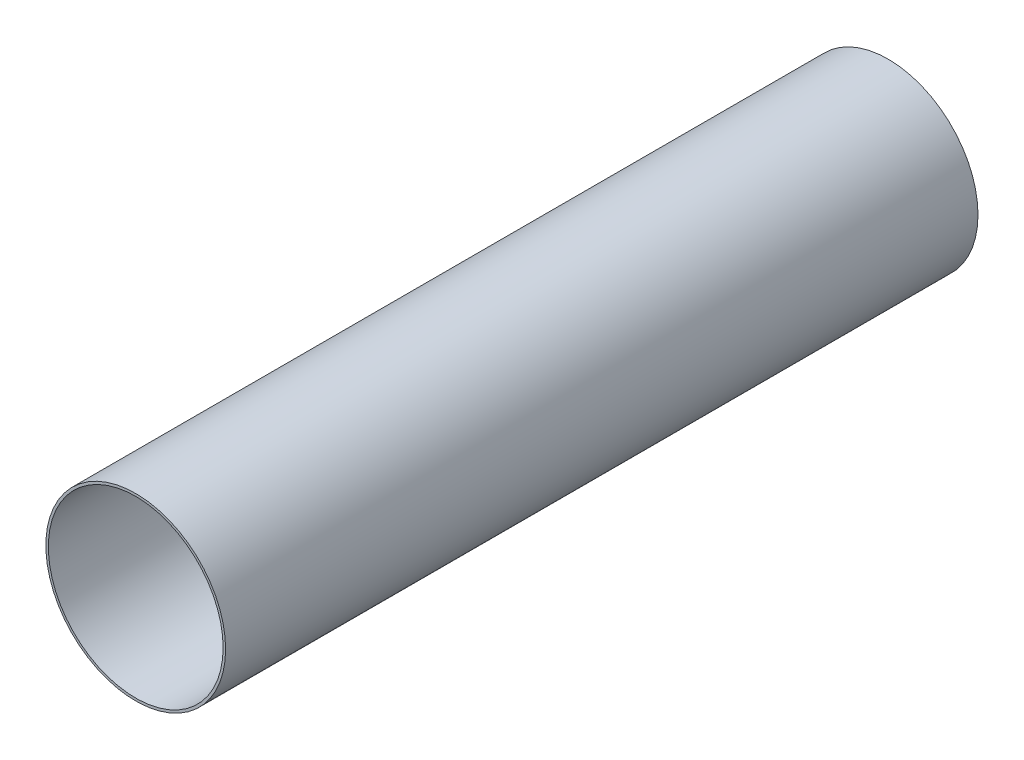
ISO-10303-21;
HEADER;
FILE_DESCRIPTION(('STEP AP214'),'2;1');
FILE_NAME('part.step','',(''),(''),'','','');
FILE_SCHEMA(('AUTOMOTIVE_DESIGN { 1 0 10303 214 1 1 1 1 }'));
ENDSEC;
DATA;
#1=APPLICATION_CONTEXT('core data for automotive mechanical design processes');
#2=APPLICATION_PROTOCOL_DEFINITION('international standard','automotive_design',2000,#1);
#3=PRODUCT_CONTEXT('',#1,'mechanical');
#4=PRODUCT('Part','Part','',(#3));
#5=PRODUCT_RELATED_PRODUCT_CATEGORY('part','',(#4));
#6=PRODUCT_DEFINITION_FORMATION('','',#4);
#7=PRODUCT_DEFINITION_CONTEXT('part definition',#1,'design');
#8=PRODUCT_DEFINITION('design','',#6,#7);
#9=PRODUCT_DEFINITION_SHAPE('','',#8);
#10=(LENGTH_UNIT() NAMED_UNIT(*) SI_UNIT(.MILLI.,.METRE.));
#11=(NAMED_UNIT(*) PLANE_ANGLE_UNIT() SI_UNIT($,.RADIAN.));
#12=(NAMED_UNIT(*) SI_UNIT($,.STERADIAN.) SOLID_ANGLE_UNIT());
#13=UNCERTAINTY_MEASURE_WITH_UNIT(LENGTH_MEASURE(1.E-05),#10,'distance_accuracy_value','');
#14=(GEOMETRIC_REPRESENTATION_CONTEXT(3) GLOBAL_UNCERTAINTY_ASSIGNED_CONTEXT((#13)) GLOBAL_UNIT_ASSIGNED_CONTEXT((#10,
#11,#12)) REPRESENTATION_CONTEXT('',''));
#15=CARTESIAN_POINT('',(0.,0.,0.));
#16=DIRECTION('',(0.,0.,1.));
#17=DIRECTION('',(1.,0.,0.));
#18=AXIS2_PLACEMENT_3D('',#15,#16,#17);
#19=CARTESIAN_POINT('',(0.,0.,655.955));
#20=DIRECTION('',(0.,0.,1.));
#21=DIRECTION('',(1.,0.,0.));
#22=AXIS2_PLACEMENT_3D('',#19,#20,#21);
#23=PLANE('',#22);
#24=CARTESIAN_POINT('',(0.,0.,655.955));
#25=DIRECTION('',(0.,0.,1.));
#26=DIRECTION('',(1.,0.,0.));
#27=AXIS2_PLACEMENT_3D('',#24,#25,#26);
#28=CIRCLE('',#27,78.359);
#29=CARTESIAN_POINT('',(78.359,0.,655.955));
#30=VERTEX_POINT('',#29);
#31=EDGE_CURVE('E10',#30,#30,#28,.T.);
#32=ORIENTED_EDGE('',*,*,#31,.T.);
#33=EDGE_LOOP('',(#32));
#34=FACE_BOUND('',#33,.T.);
#35=CARTESIAN_POINT('',(0.,0.,655.955));
#36=DIRECTION('',(0.,0.,1.));
#37=DIRECTION('',(1.,0.,0.));
#38=AXIS2_PLACEMENT_3D('',#35,#36,#37);
#39=CIRCLE('',#38,76.2);
#40=CARTESIAN_POINT('',(76.2,0.,655.955));
#41=VERTEX_POINT('',#40);
#42=EDGE_CURVE('E50',#41,#41,#39,.T.);
#43=ORIENTED_EDGE('',*,*,#42,.F.);
#44=EDGE_LOOP('',(#43));
#45=FACE_BOUND('',#44,.T.);
#46=ADVANCED_FACE('F37',(#34,#45),#23,.T.);
#47=CARTESIAN_POINT('',(0.,0.,0.));
#48=DIRECTION('',(0.,0.,1.));
#49=DIRECTION('',(1.,0.,0.));
#50=AXIS2_PLACEMENT_3D('',#47,#48,#49);
#51=PLANE('',#50);
#52=CARTESIAN_POINT('',(0.,0.,0.));
#53=DIRECTION('',(0.,0.,1.));
#54=DIRECTION('',(1.,0.,0.));
#55=AXIS2_PLACEMENT_3D('',#52,#53,#54);
#56=CIRCLE('',#55,78.359);
#57=CARTESIAN_POINT('',(78.359,0.,0.));
#58=VERTEX_POINT('',#57);
#59=EDGE_CURVE('E41',#58,#58,#56,.T.);
#60=ORIENTED_EDGE('',*,*,#59,.F.);
#61=EDGE_LOOP('',(#60));
#62=FACE_BOUND('',#61,.T.);
#63=CARTESIAN_POINT('',(0.,0.,0.));
#64=DIRECTION('',(0.,0.,1.));
#65=DIRECTION('',(1.,0.,0.));
#66=AXIS2_PLACEMENT_3D('',#63,#64,#65);
#67=CIRCLE('',#66,76.2);
#68=CARTESIAN_POINT('',(76.2,0.,0.));
#69=VERTEX_POINT('',#68);
#70=EDGE_CURVE('E52',#69,#69,#67,.T.);
#71=ORIENTED_EDGE('',*,*,#70,.T.);
#72=EDGE_LOOP('',(#71));
#73=FACE_BOUND('',#72,.T.);
#74=ADVANCED_FACE('F64',(#62,#73),#51,.F.);
#75=CARTESIAN_POINT('',(0.,0.,655.955));
#76=DIRECTION('',(0.,0.,-1.));
#77=DIRECTION('',(-1.,0.,0.));
#78=AXIS2_PLACEMENT_3D('',#75,#76,#77);
#79=CYLINDRICAL_SURFACE('',#78,78.359);
#80=ORIENTED_EDGE('',*,*,#31,.F.);
#81=EDGE_LOOP('',(#80));
#82=FACE_BOUND('',#81,.T.);
#83=ORIENTED_EDGE('',*,*,#59,.T.);
#84=EDGE_LOOP('',(#83));
#85=FACE_BOUND('',#84,.T.);
#86=ADVANCED_FACE('F39',(#82,#85),#79,.T.);
#87=CARTESIAN_POINT('',(0.,0.,655.955));
#88=DIRECTION('',(0.,0.,-1.));
#89=DIRECTION('',(-1.,0.,0.));
#90=AXIS2_PLACEMENT_3D('',#87,#88,#89);
#91=CYLINDRICAL_SURFACE('',#90,76.2);
#92=ORIENTED_EDGE('',*,*,#42,.T.);
#93=EDGE_LOOP('',(#92));
#94=FACE_BOUND('',#93,.T.);
#95=ORIENTED_EDGE('',*,*,#70,.F.);
#96=EDGE_LOOP('',(#95));
#97=FACE_BOUND('',#96,.T.);
#98=ADVANCED_FACE('F60',(#94,#97),#91,.F.);
#99=CLOSED_SHELL('',(#46,#74,#86,#98));
#100=MANIFOLD_SOLID_BREP('B2',#99);
#101=ADVANCED_BREP_SHAPE_REPRESENTATION('',(#18,#100),#14);
#102=SHAPE_DEFINITION_REPRESENTATION(#9,#101);
ENDSEC;
END-ISO-10303-21;
